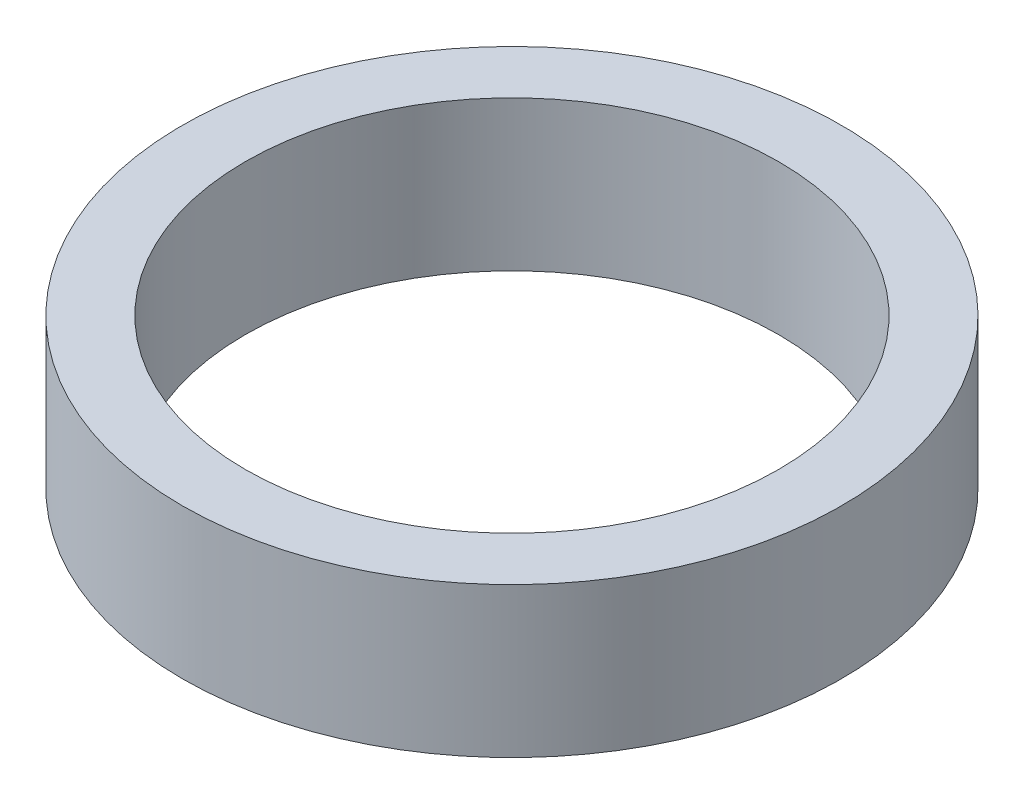
ISO-10303-21;
HEADER;
FILE_DESCRIPTION(('STEP AP214'),'2;1');
FILE_NAME('part.step','',(''),(''),'','','');
FILE_SCHEMA(('AUTOMOTIVE_DESIGN { 1 0 10303 214 1 1 1 1 }'));
ENDSEC;
DATA;
#1=APPLICATION_CONTEXT('core data for automotive mechanical design processes');
#2=APPLICATION_PROTOCOL_DEFINITION('international standard','automotive_design',2000,#1);
#3=PRODUCT_CONTEXT('',#1,'mechanical');
#4=PRODUCT('Part','Part','',(#3));
#5=PRODUCT_RELATED_PRODUCT_CATEGORY('part','',(#4));
#6=PRODUCT_DEFINITION_FORMATION('','',#4);
#7=PRODUCT_DEFINITION_CONTEXT('part definition',#1,'design');
#8=PRODUCT_DEFINITION('design','',#6,#7);
#9=PRODUCT_DEFINITION_SHAPE('','',#8);
#10=(LENGTH_UNIT() NAMED_UNIT(*) SI_UNIT(.MILLI.,.METRE.));
#11=(NAMED_UNIT(*) PLANE_ANGLE_UNIT() SI_UNIT($,.RADIAN.));
#12=(NAMED_UNIT(*) SI_UNIT($,.STERADIAN.) SOLID_ANGLE_UNIT());
#13=UNCERTAINTY_MEASURE_WITH_UNIT(LENGTH_MEASURE(1.E-05),#10,'distance_accuracy_value','');
#14=(GEOMETRIC_REPRESENTATION_CONTEXT(3) GLOBAL_UNCERTAINTY_ASSIGNED_CONTEXT((#13)) GLOBAL_UNIT_ASSIGNED_CONTEXT((#10,
#11,#12)) REPRESENTATION_CONTEXT('',''));
#15=CARTESIAN_POINT('',(0.,0.,0.));
#16=DIRECTION('',(0.,0.,1.));
#17=DIRECTION('',(1.,0.,0.));
#18=AXIS2_PLACEMENT_3D('',#15,#16,#17);
#19=CARTESIAN_POINT('',(0.,5.,0.));
#20=DIRECTION('',(0.,1.,0.));
#21=DIRECTION('',(0.,0.,1.));
#22=AXIS2_PLACEMENT_3D('',#19,#20,#21);
#23=PLANE('',#22);
#24=CARTESIAN_POINT('',(0.,5.,0.));
#25=DIRECTION('',(0.,1.,0.));
#26=DIRECTION('',(0.,0.,1.));
#27=AXIS2_PLACEMENT_3D('',#24,#25,#26);
#28=CIRCLE('',#27,11.);
#29=CARTESIAN_POINT('',(0.,5.,11.));
#30=VERTEX_POINT('',#29);
#31=EDGE_CURVE('E10',#30,#30,#28,.T.);
#32=ORIENTED_EDGE('',*,*,#31,.T.);
#33=EDGE_LOOP('',(#32));
#34=FACE_BOUND('',#33,.T.);
#35=CARTESIAN_POINT('',(0.,5.,0.));
#36=DIRECTION('',(0.,1.,0.));
#37=DIRECTION('',(0.,0.,1.));
#38=AXIS2_PLACEMENT_3D('',#35,#36,#37);
#39=CIRCLE('',#38,8.9);
#40=CARTESIAN_POINT('',(0.,5.,8.9));
#41=VERTEX_POINT('',#40);
#42=EDGE_CURVE('E45',#41,#41,#39,.T.);
#43=ORIENTED_EDGE('',*,*,#42,.F.);
#44=EDGE_LOOP('',(#43));
#45=FACE_BOUND('',#44,.T.);
#46=ADVANCED_FACE('F34',(#34,#45),#23,.T.);
#47=CARTESIAN_POINT('',(0.,0.,0.));
#48=DIRECTION('',(0.,1.,0.));
#49=DIRECTION('',(0.,0.,1.));
#50=AXIS2_PLACEMENT_3D('',#47,#48,#49);
#51=PLANE('',#50);
#52=CARTESIAN_POINT('',(0.,0.,0.));
#53=DIRECTION('',(0.,1.,0.));
#54=DIRECTION('',(0.,0.,1.));
#55=AXIS2_PLACEMENT_3D('',#52,#53,#54);
#56=CIRCLE('',#55,11.);
#57=CARTESIAN_POINT('',(0.,0.,11.));
#58=VERTEX_POINT('',#57);
#59=EDGE_CURVE('E38',#58,#58,#56,.T.);
#60=ORIENTED_EDGE('',*,*,#59,.F.);
#61=EDGE_LOOP('',(#60));
#62=FACE_BOUND('',#61,.T.);
#63=CARTESIAN_POINT('',(0.,0.,0.));
#64=DIRECTION('',(0.,1.,0.));
#65=DIRECTION('',(0.,0.,1.));
#66=AXIS2_PLACEMENT_3D('',#63,#64,#65);
#67=CIRCLE('',#66,8.9);
#68=CARTESIAN_POINT('',(0.,0.,8.9));
#69=VERTEX_POINT('',#68);
#70=EDGE_CURVE('E47',#69,#69,#67,.T.);
#71=ORIENTED_EDGE('',*,*,#70,.T.);
#72=EDGE_LOOP('',(#71));
#73=FACE_BOUND('',#72,.T.);
#74=ADVANCED_FACE('F57',(#62,#73),#51,.F.);
#75=CARTESIAN_POINT('',(0.,5.,0.));
#76=DIRECTION('',(0.,-1.,0.));
#77=DIRECTION('',(0.,0.,-1.));
#78=AXIS2_PLACEMENT_3D('',#75,#76,#77);
#79=CYLINDRICAL_SURFACE('',#78,11.);
#80=ORIENTED_EDGE('',*,*,#31,.F.);
#81=EDGE_LOOP('',(#80));
#82=FACE_BOUND('',#81,.T.);
#83=ORIENTED_EDGE('',*,*,#59,.T.);
#84=EDGE_LOOP('',(#83));
#85=FACE_BOUND('',#84,.T.);
#86=ADVANCED_FACE('F36',(#82,#85),#79,.T.);
#87=CARTESIAN_POINT('',(0.,5.,0.));
#88=DIRECTION('',(0.,-1.,0.));
#89=DIRECTION('',(0.,0.,-1.));
#90=AXIS2_PLACEMENT_3D('',#87,#88,#89);
#91=CYLINDRICAL_SURFACE('',#90,8.9);
#92=ORIENTED_EDGE('',*,*,#42,.T.);
#93=EDGE_LOOP('',(#92));
#94=FACE_BOUND('',#93,.T.);
#95=ORIENTED_EDGE('',*,*,#70,.F.);
#96=EDGE_LOOP('',(#95));
#97=FACE_BOUND('',#96,.T.);
#98=ADVANCED_FACE('F53',(#94,#97),#91,.F.);
#99=CLOSED_SHELL('',(#46,#74,#86,#98));
#100=MANIFOLD_SOLID_BREP('B2',#99);
#101=ADVANCED_BREP_SHAPE_REPRESENTATION('',(#18,#100),#14);
#102=SHAPE_DEFINITION_REPRESENTATION(#9,#101);
ENDSEC;
END-ISO-10303-21;
